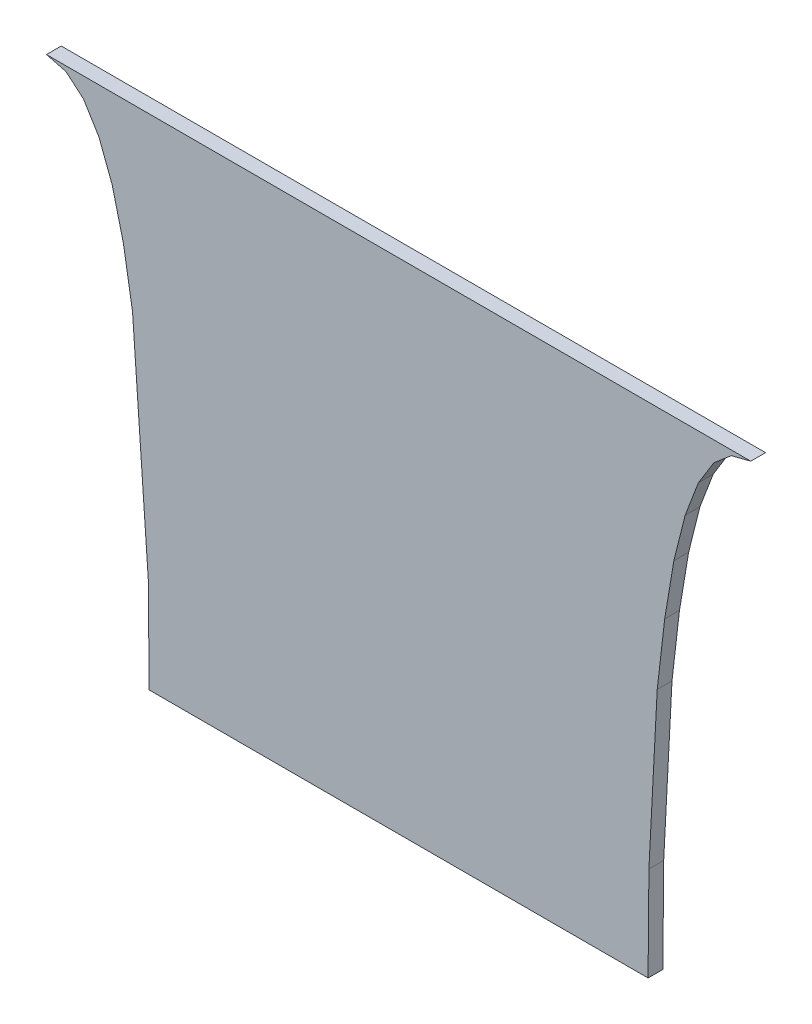
ISO-10303-21;
HEADER;
FILE_DESCRIPTION(('STEP AP214'),'2;1');
FILE_NAME('part.step','',(''),(''),'','','');
FILE_SCHEMA(('AUTOMOTIVE_DESIGN { 1 0 10303 214 1 1 1 1 }'));
ENDSEC;
DATA;
#1=APPLICATION_CONTEXT('core data for automotive mechanical design processes');
#2=APPLICATION_PROTOCOL_DEFINITION('international standard','automotive_design',2000,#1);
#3=PRODUCT_CONTEXT('',#1,'mechanical');
#4=PRODUCT('Part','Part','',(#3));
#5=PRODUCT_RELATED_PRODUCT_CATEGORY('part','',(#4));
#6=PRODUCT_DEFINITION_FORMATION('','',#4);
#7=PRODUCT_DEFINITION_CONTEXT('part definition',#1,'design');
#8=PRODUCT_DEFINITION('design','',#6,#7);
#9=PRODUCT_DEFINITION_SHAPE('','',#8);
#10=(LENGTH_UNIT() NAMED_UNIT(*) SI_UNIT(.MILLI.,.METRE.));
#11=(NAMED_UNIT(*) PLANE_ANGLE_UNIT() SI_UNIT($,.RADIAN.));
#12=(NAMED_UNIT(*) SI_UNIT($,.STERADIAN.) SOLID_ANGLE_UNIT());
#13=UNCERTAINTY_MEASURE_WITH_UNIT(LENGTH_MEASURE(1.E-05),#10,'distance_accuracy_value','');
#14=(GEOMETRIC_REPRESENTATION_CONTEXT(3) GLOBAL_UNCERTAINTY_ASSIGNED_CONTEXT((#13)) GLOBAL_UNIT_ASSIGNED_CONTEXT((#10,
#11,#12)) REPRESENTATION_CONTEXT('',''));
#15=CARTESIAN_POINT('',(0.,0.,0.));
#16=DIRECTION('',(0.,0.,1.));
#17=DIRECTION('',(1.,0.,0.));
#18=AXIS2_PLACEMENT_3D('',#15,#16,#17);
#19=CARTESIAN_POINT('',(55.4799995422363,60.5530014038086,0.));
#20=DIRECTION('',(-0.999961570025521,0.00876689637754941,0.));
#21=DIRECTION('',(0.00876689637754941,0.999961570025521,0.));
#22=AXIS2_PLACEMENT_3D('',#19,#20,#21);
#23=PLANE('',#22);
#24=DIRECTION('',(0.00876689637754941,0.999961570025521,0.));
#25=VECTOR('',#24,1.);
#26=CARTESIAN_POINT('',(55.4799995422363,60.5530014038086,0.03556));
#27=LINE('',#26,#25);
#28=CARTESIAN_POINT('',(55.4799995422363,60.5530014038086,0.03556));
#29=VERTEX_POINT('',#28);
#30=CARTESIAN_POINT('',(55.4819984436035,60.7809982299805,0.03556));
#31=VERTEX_POINT('',#30);
#32=EDGE_CURVE('E11',#29,#31,#27,.T.);
#33=ORIENTED_EDGE('',*,*,#32,.F.);
#34=DIRECTION('',(0.,0.,1.));
#35=VECTOR('',#34,1.);
#36=CARTESIAN_POINT('',(55.4799995422363,60.5530014038086,0.));
#37=LINE('',#36,#35);
#38=CARTESIAN_POINT('',(55.4799995422363,60.5530014038086,0.));
#39=VERTEX_POINT('',#38);
#40=EDGE_CURVE('E24',#39,#29,#37,.T.);
#41=ORIENTED_EDGE('',*,*,#40,.F.);
#42=DIRECTION('',(0.00876689637754941,0.999961570025521,0.));
#43=VECTOR('',#42,1.);
#44=CARTESIAN_POINT('',(55.4799995422363,60.5530014038086,0.));
#45=LINE('',#44,#43);
#46=CARTESIAN_POINT('',(55.4819984436035,60.7809982299805,0.));
#47=VERTEX_POINT('',#46);
#48=EDGE_CURVE('E166',#39,#47,#45,.T.);
#49=ORIENTED_EDGE('',*,*,#48,.T.);
#50=DIRECTION('',(0.,0.,1.));
#51=VECTOR('',#50,1.);
#52=CARTESIAN_POINT('',(55.4819984436035,60.7809982299805,0.));
#53=LINE('',#52,#51);
#54=EDGE_CURVE('E37',#47,#31,#53,.T.);
#55=ORIENTED_EDGE('',*,*,#54,.T.);
#56=EDGE_LOOP('',(#33,#41,#49,#55));
#57=FACE_BOUND('',#56,.T.);
#58=ADVANCED_FACE('F17',(#57),#23,.F.);
#59=CARTESIAN_POINT('',(55.4819984436035,60.7809982299805,0.));
#60=DIRECTION('',(-0.998646373503575,0.0520136586692287,0.));
#61=DIRECTION('',(0.0520136586692287,0.998646373503575,0.));
#62=AXIS2_PLACEMENT_3D('',#59,#60,#61);
#63=PLANE('',#62);
#64=DIRECTION('',(0.0520136586692287,0.998646373503575,0.));
#65=VECTOR('',#64,1.);
#66=CARTESIAN_POINT('',(55.4819984436035,60.7809982299805,0.03556));
#67=LINE('',#66,#65);
#68=CARTESIAN_POINT('',(55.5019989013672,61.1650009155274,0.03556));
#69=VERTEX_POINT('',#68);
#70=EDGE_CURVE('E294',#31,#69,#67,.T.);
#71=ORIENTED_EDGE('',*,*,#70,.F.);
#72=ORIENTED_EDGE('',*,*,#54,.F.);
#73=DIRECTION('',(0.0520136586692287,0.998646373503575,0.));
#74=VECTOR('',#73,1.);
#75=CARTESIAN_POINT('',(55.4819984436035,60.7809982299805,0.));
#76=LINE('',#75,#74);
#77=CARTESIAN_POINT('',(55.5019989013672,61.1650009155274,0.));
#78=VERTEX_POINT('',#77);
#79=EDGE_CURVE('E291',#47,#78,#76,.T.);
#80=ORIENTED_EDGE('',*,*,#79,.T.);
#81=DIRECTION('',(0.,0.,1.));
#82=VECTOR('',#81,1.);
#83=CARTESIAN_POINT('',(55.5019989013672,61.1650009155274,0.));
#84=LINE('',#83,#82);
#85=EDGE_CURVE('E289',#78,#69,#84,.T.);
#86=ORIENTED_EDGE('',*,*,#85,.T.);
#87=EDGE_LOOP('',(#71,#72,#80,#86));
#88=FACE_BOUND('',#87,.T.);
#89=ADVANCED_FACE('F302',(#88),#63,.F.);
#90=CARTESIAN_POINT('',(55.5019989013672,61.1650009155274,0.));
#91=DIRECTION('',(-0.993407659136023,0.114635172481608,0.));
#92=DIRECTION('',(0.114635172481608,0.993407659136023,0.));
#93=AXIS2_PLACEMENT_3D('',#90,#91,#92);
#94=PLANE('',#93);
#95=DIRECTION('',(0.114635172481608,0.993407659136023,0.));
#96=VECTOR('',#95,1.);
#97=CARTESIAN_POINT('',(55.5019989013672,61.1650009155274,0.03556));
#98=LINE('',#97,#96);
#99=CARTESIAN_POINT('',(55.5200004577637,61.3209991455078,0.03556));
#100=VERTEX_POINT('',#99);
#101=EDGE_CURVE('E286',#69,#100,#98,.T.);
#102=ORIENTED_EDGE('',*,*,#101,.F.);
#103=ORIENTED_EDGE('',*,*,#85,.F.);
#104=DIRECTION('',(0.114635172481608,0.993407659136023,0.));
#105=VECTOR('',#104,1.);
#106=CARTESIAN_POINT('',(55.5019989013672,61.1650009155274,0.));
#107=LINE('',#106,#105);
#108=CARTESIAN_POINT('',(55.5200004577637,61.3209991455078,0.));
#109=VERTEX_POINT('',#108);
#110=EDGE_CURVE('E283',#78,#109,#107,.T.);
#111=ORIENTED_EDGE('',*,*,#110,.T.);
#112=DIRECTION('',(0.,0.,1.));
#113=VECTOR('',#112,1.);
#114=CARTESIAN_POINT('',(55.5200004577637,61.3209991455078,0.));
#115=LINE('',#114,#113);
#116=EDGE_CURVE('E281',#109,#100,#115,.T.);
#117=ORIENTED_EDGE('',*,*,#116,.T.);
#118=EDGE_LOOP('',(#102,#103,#111,#117));
#119=FACE_BOUND('',#118,.T.);
#120=ADVANCED_FACE('F308',(#119),#94,.F.);
#121=CARTESIAN_POINT('',(55.5200004577637,61.3209991455078,0.));
#122=DIRECTION('',(-0.986394694254976,0.16439436470157,0.));
#123=DIRECTION('',(0.16439436470157,0.986394694254976,0.));
#124=AXIS2_PLACEMENT_3D('',#121,#122,#123);
#125=PLANE('',#124);
#126=DIRECTION('',(0.16439436470157,0.986394694254976,0.));
#127=VECTOR('',#126,1.);
#128=CARTESIAN_POINT('',(55.5200004577637,61.3209991455078,0.03556));
#129=LINE('',#128,#127);
#130=CARTESIAN_POINT('',(55.5419998168945,61.4529991149902,0.03556));
#131=VERTEX_POINT('',#130);
#132=EDGE_CURVE('E278',#100,#131,#129,.T.);
#133=ORIENTED_EDGE('',*,*,#132,.F.);
#134=ORIENTED_EDGE('',*,*,#116,.F.);
#135=DIRECTION('',(0.16439436470157,0.986394694254976,0.));
#136=VECTOR('',#135,1.);
#137=CARTESIAN_POINT('',(55.5200004577637,61.3209991455078,0.));
#138=LINE('',#137,#136);
#139=CARTESIAN_POINT('',(55.5419998168945,61.4529991149902,0.));
#140=VERTEX_POINT('',#139);
#141=EDGE_CURVE('E275',#109,#140,#138,.T.);
#142=ORIENTED_EDGE('',*,*,#141,.T.);
#143=DIRECTION('',(0.,0.,1.));
#144=VECTOR('',#143,1.);
#145=CARTESIAN_POINT('',(55.5419998168945,61.4529991149902,0.));
#146=LINE('',#145,#144);
#147=EDGE_CURVE('E273',#140,#131,#146,.T.);
#148=ORIENTED_EDGE('',*,*,#147,.T.);
#149=EDGE_LOOP('',(#133,#134,#142,#148));
#150=FACE_BOUND('',#149,.T.);
#151=ADVANCED_FACE('F310',(#150),#125,.F.);
#152=CARTESIAN_POINT('',(55.5419998168945,61.4529991149902,0.));
#153=DIRECTION('',(-0.970142500145332,0.242535625036333,0.));
#154=DIRECTION('',(0.242535625036333,0.970142500145332,0.));
#155=AXIS2_PLACEMENT_3D('',#152,#153,#154);
#156=PLANE('',#155);
#157=DIRECTION('',(0.242535625036333,0.970142500145332,0.));
#158=VECTOR('',#157,1.);
#159=CARTESIAN_POINT('',(55.5419998168945,61.4529991149902,0.03556));
#160=LINE('',#159,#158);
#161=CARTESIAN_POINT('',(55.5690002441406,61.5610008239746,0.03556));
#162=VERTEX_POINT('',#161);
#163=EDGE_CURVE('E270',#131,#162,#160,.T.);
#164=ORIENTED_EDGE('',*,*,#163,.F.);
#165=ORIENTED_EDGE('',*,*,#147,.F.);
#166=DIRECTION('',(0.242535625036333,0.970142500145332,0.));
#167=VECTOR('',#166,1.);
#168=CARTESIAN_POINT('',(55.5419998168945,61.4529991149902,0.));
#169=LINE('',#168,#167);
#170=CARTESIAN_POINT('',(55.5690002441406,61.5610008239746,0.));
#171=VERTEX_POINT('',#170);
#172=EDGE_CURVE('E267',#140,#171,#169,.T.);
#173=ORIENTED_EDGE('',*,*,#172,.T.);
#174=DIRECTION('',(0.,0.,1.));
#175=VECTOR('',#174,1.);
#176=CARTESIAN_POINT('',(55.5690002441406,61.5610008239746,0.));
#177=LINE('',#176,#175);
#178=EDGE_CURVE('E265',#171,#162,#177,.T.);
#179=ORIENTED_EDGE('',*,*,#178,.T.);
#180=EDGE_LOOP('',(#164,#165,#173,#179));
#181=FACE_BOUND('',#180,.T.);
#182=ADVANCED_FACE('F315',(#181),#156,.F.);
#183=CARTESIAN_POINT('',(55.5690002441406,61.5610008239746,0.));
#184=DIRECTION('',(-0.934481684247574,0.356011210224927,0.));
#185=DIRECTION('',(0.356011210224927,0.934481684247574,0.));
#186=AXIS2_PLACEMENT_3D('',#183,#184,#185);
#187=PLANE('',#186);
#188=DIRECTION('',(0.356011210224927,0.934481684247574,0.));
#189=VECTOR('',#188,1.);
#190=CARTESIAN_POINT('',(55.5690002441406,61.5610008239746,0.03556));
#191=LINE('',#190,#189);
#192=CARTESIAN_POINT('',(55.601001739502,61.6450004577637,0.03556));
#193=VERTEX_POINT('',#192);
#194=EDGE_CURVE('E262',#162,#193,#191,.T.);
#195=ORIENTED_EDGE('',*,*,#194,.F.);
#196=ORIENTED_EDGE('',*,*,#178,.F.);
#197=DIRECTION('',(0.356011210224927,0.934481684247574,0.));
#198=VECTOR('',#197,1.);
#199=CARTESIAN_POINT('',(55.5690002441406,61.5610008239746,0.));
#200=LINE('',#199,#198);
#201=CARTESIAN_POINT('',(55.601001739502,61.6450004577637,0.));
#202=VERTEX_POINT('',#201);
#203=EDGE_CURVE('E259',#171,#202,#200,.T.);
#204=ORIENTED_EDGE('',*,*,#203,.T.);
#205=DIRECTION('',(0.,0.,1.));
#206=VECTOR('',#205,1.);
#207=CARTESIAN_POINT('',(55.601001739502,61.6450004577637,0.));
#208=LINE('',#207,#206);
#209=EDGE_CURVE('E257',#202,#193,#208,.T.);
#210=ORIENTED_EDGE('',*,*,#209,.T.);
#211=EDGE_LOOP('',(#195,#196,#204,#210));
#212=FACE_BOUND('',#211,.T.);
#213=ADVANCED_FACE('F318',(#212),#187,.F.);
#214=CARTESIAN_POINT('',(55.601001739502,61.6450004577637,0.));
#215=DIRECTION('',(-0.851184166923057,0.524867139359573,0.));
#216=DIRECTION('',(0.524867139359573,0.851184166923057,0.));
#217=AXIS2_PLACEMENT_3D('',#214,#215,#216);
#218=PLANE('',#217);
#219=DIRECTION('',(0.524867139359573,0.851184166923057,0.));
#220=VECTOR('',#219,1.);
#221=CARTESIAN_POINT('',(55.601001739502,61.6450004577637,0.03556));
#222=LINE('',#221,#220);
#223=CARTESIAN_POINT('',(55.6380004882812,61.7050018310547,0.03556));
#224=VERTEX_POINT('',#223);
#225=EDGE_CURVE('E254',#193,#224,#222,.T.);
#226=ORIENTED_EDGE('',*,*,#225,.F.);
#227=ORIENTED_EDGE('',*,*,#209,.F.);
#228=DIRECTION('',(0.524867139359573,0.851184166923057,0.));
#229=VECTOR('',#228,1.);
#230=CARTESIAN_POINT('',(55.601001739502,61.6450004577637,0.));
#231=LINE('',#230,#229);
#232=CARTESIAN_POINT('',(55.6380004882812,61.7050018310547,0.));
#233=VERTEX_POINT('',#232);
#234=EDGE_CURVE('E251',#202,#233,#231,.T.);
#235=ORIENTED_EDGE('',*,*,#234,.T.);
#236=DIRECTION('',(0.,0.,1.));
#237=VECTOR('',#236,1.);
#238=CARTESIAN_POINT('',(55.6380004882812,61.7050018310547,0.));
#239=LINE('',#238,#237);
#240=EDGE_CURVE('E249',#233,#224,#239,.T.);
#241=ORIENTED_EDGE('',*,*,#240,.T.);
#242=EDGE_LOOP('',(#226,#227,#235,#241));
#243=FACE_BOUND('',#242,.T.);
#244=ADVANCED_FACE('F323',(#243),#218,.F.);
#245=CARTESIAN_POINT('',(55.6380004882812,61.7050018310547,0.));
#246=DIRECTION('',(-0.650785694290153,0.759261470184866,0.));
#247=DIRECTION('',(0.759261470184866,0.650785694290153,0.));
#248=AXIS2_PLACEMENT_3D('',#245,#246,#247);
#249=PLANE('',#248);
#250=DIRECTION('',(0.759261470184866,0.650785694290152,0.));
#251=VECTOR('',#250,1.);
#252=CARTESIAN_POINT('',(55.6380004882812,61.7050018310547,0.03556));
#253=LINE('',#252,#251);
#254=CARTESIAN_POINT('',(55.6800003051758,61.7410011291504,0.03556));
#255=VERTEX_POINT('',#254);
#256=EDGE_CURVE('E246',#224,#255,#253,.T.);
#257=ORIENTED_EDGE('',*,*,#256,.F.);
#258=ORIENTED_EDGE('',*,*,#240,.F.);
#259=DIRECTION('',(0.759261470184866,0.650785694290152,0.));
#260=VECTOR('',#259,1.);
#261=CARTESIAN_POINT('',(55.6380004882812,61.7050018310547,0.));
#262=LINE('',#261,#260);
#263=CARTESIAN_POINT('',(55.6800003051758,61.7410011291504,0.));
#264=VERTEX_POINT('',#263);
#265=EDGE_CURVE('E243',#233,#264,#262,.T.);
#266=ORIENTED_EDGE('',*,*,#265,.T.);
#267=DIRECTION('',(0.,0.,1.));
#268=VECTOR('',#267,1.);
#269=CARTESIAN_POINT('',(55.6800003051758,61.7410011291504,0.));
#270=LINE('',#269,#268);
#271=EDGE_CURVE('E241',#264,#255,#270,.T.);
#272=ORIENTED_EDGE('',*,*,#271,.T.);
#273=EDGE_LOOP('',(#257,#258,#266,#272));
#274=FACE_BOUND('',#273,.T.);
#275=ADVANCED_FACE('F326',(#274),#249,.F.);
#276=CARTESIAN_POINT('',(55.6800003051758,61.7410011291504,0.));
#277=DIRECTION('',(-0.247325124869417,0.968932548017832,0.));
#278=DIRECTION('',(0.968932548017832,0.247325124869417,0.));
#279=AXIS2_PLACEMENT_3D('',#276,#277,#278);
#280=PLANE('',#279);
#281=DIRECTION('',(0.968932548017832,0.247325124869417,0.));
#282=VECTOR('',#281,1.);
#283=CARTESIAN_POINT('',(55.6800003051758,61.7410011291504,0.03556));
#284=LINE('',#283,#282);
#285=CARTESIAN_POINT('',(55.7270011901855,61.7529983520508,0.03556));
#286=VERTEX_POINT('',#285);
#287=EDGE_CURVE('E238',#255,#286,#284,.T.);
#288=ORIENTED_EDGE('',*,*,#287,.F.);
#289=ORIENTED_EDGE('',*,*,#271,.F.);
#290=DIRECTION('',(0.968932548017832,0.247325124869417,0.));
#291=VECTOR('',#290,1.);
#292=CARTESIAN_POINT('',(55.6800003051758,61.7410011291504,0.));
#293=LINE('',#292,#291);
#294=CARTESIAN_POINT('',(55.7270011901855,61.7529983520508,0.));
#295=VERTEX_POINT('',#294);
#296=EDGE_CURVE('E235',#264,#295,#293,.T.);
#297=ORIENTED_EDGE('',*,*,#296,.T.);
#298=DIRECTION('',(0.,0.,1.));
#299=VECTOR('',#298,1.);
#300=CARTESIAN_POINT('',(55.7270011901855,61.7529983520508,0.));
#301=LINE('',#300,#299);
#302=EDGE_CURVE('E233',#295,#286,#301,.T.);
#303=ORIENTED_EDGE('',*,*,#302,.T.);
#304=EDGE_LOOP('',(#288,#289,#297,#303));
#305=FACE_BOUND('',#304,.T.);
#306=ADVANCED_FACE('F331',(#305),#280,.F.);
#307=CARTESIAN_POINT('',(55.7270011901855,61.7529983520508,0.));
#308=DIRECTION('',(0.,-1.,0.));
#309=DIRECTION('',(-1.,0.,0.));
#310=AXIS2_PLACEMENT_3D('',#307,#308,#309);
#311=PLANE('',#310);
#312=DIRECTION('',(-1.,0.,0.));
#313=VECTOR('',#312,1.);
#314=CARTESIAN_POINT('',(55.7270011901855,61.7529983520508,0.03556));
#315=LINE('',#314,#313);
#316=CARTESIAN_POINT('',(54.0330009460449,61.7529983520508,0.03556));
#317=VERTEX_POINT('',#316);
#318=EDGE_CURVE('E230',#286,#317,#315,.T.);
#319=ORIENTED_EDGE('',*,*,#318,.F.);
#320=ORIENTED_EDGE('',*,*,#302,.F.);
#321=DIRECTION('',(-1.,0.,0.));
#322=VECTOR('',#321,1.);
#323=CARTESIAN_POINT('',(55.7270011901855,61.7529983520508,0.));
#324=LINE('',#323,#322);
#325=CARTESIAN_POINT('',(54.0330009460449,61.7529983520508,0.));
#326=VERTEX_POINT('',#325);
#327=EDGE_CURVE('E227',#295,#326,#324,.T.);
#328=ORIENTED_EDGE('',*,*,#327,.T.);
#329=DIRECTION('',(0.,0.,1.));
#330=VECTOR('',#329,1.);
#331=CARTESIAN_POINT('',(54.0330009460449,61.7529983520508,0.));
#332=LINE('',#331,#330);
#333=EDGE_CURVE('E225',#326,#317,#332,.T.);
#334=ORIENTED_EDGE('',*,*,#333,.T.);
#335=EDGE_LOOP('',(#319,#320,#328,#334));
#336=FACE_BOUND('',#335,.T.);
#337=ADVANCED_FACE('F334',(#336),#311,.F.);
#338=CARTESIAN_POINT('',(54.0330009460449,61.7529983520508,0.));
#339=DIRECTION('',(0.247325124869417,0.968932548017832,0.));
#340=DIRECTION('',(0.968932548017832,-0.247325124869417,0.));
#341=AXIS2_PLACEMENT_3D('',#338,#339,#340);
#342=PLANE('',#341);
#343=DIRECTION('',(0.968932548017832,-0.247325124869417,0.));
#344=VECTOR('',#343,1.);
#345=CARTESIAN_POINT('',(54.0330009460449,61.7529983520508,0.03556));
#346=LINE('',#345,#344);
#347=CARTESIAN_POINT('',(54.0800018310547,61.7410011291504,0.03556));
#348=VERTEX_POINT('',#347);
#349=EDGE_CURVE('E222',#317,#348,#346,.T.);
#350=ORIENTED_EDGE('',*,*,#349,.F.);
#351=ORIENTED_EDGE('',*,*,#333,.F.);
#352=DIRECTION('',(0.968932548017832,-0.247325124869417,0.));
#353=VECTOR('',#352,1.);
#354=CARTESIAN_POINT('',(54.0330009460449,61.7529983520508,0.));
#355=LINE('',#354,#353);
#356=CARTESIAN_POINT('',(54.0800018310547,61.7410011291504,0.));
#357=VERTEX_POINT('',#356);
#358=EDGE_CURVE('E219',#326,#357,#355,.T.);
#359=ORIENTED_EDGE('',*,*,#358,.T.);
#360=DIRECTION('',(0.,0.,1.));
#361=VECTOR('',#360,1.);
#362=CARTESIAN_POINT('',(54.0800018310547,61.7410011291504,0.));
#363=LINE('',#362,#361);
#364=EDGE_CURVE('E217',#357,#348,#363,.T.);
#365=ORIENTED_EDGE('',*,*,#364,.T.);
#366=EDGE_LOOP('',(#350,#351,#359,#365));
#367=FACE_BOUND('',#366,.T.);
#368=ADVANCED_FACE('F339',(#367),#342,.F.);
#369=CARTESIAN_POINT('',(54.0800018310547,61.7410011291504,0.));
#370=DIRECTION('',(0.650785694290153,0.759261470184866,0.));
#371=DIRECTION('',(0.759261470184866,-0.650785694290153,0.));
#372=AXIS2_PLACEMENT_3D('',#369,#370,#371);
#373=PLANE('',#372);
#374=DIRECTION('',(0.759261470184866,-0.650785694290152,0.));
#375=VECTOR('',#374,1.);
#376=CARTESIAN_POINT('',(54.0800018310547,61.7410011291504,0.03556));
#377=LINE('',#376,#375);
#378=CARTESIAN_POINT('',(54.1220016479492,61.7050018310547,0.03556));
#379=VERTEX_POINT('',#378);
#380=EDGE_CURVE('E214',#348,#379,#377,.T.);
#381=ORIENTED_EDGE('',*,*,#380,.F.);
#382=ORIENTED_EDGE('',*,*,#364,.F.);
#383=DIRECTION('',(0.759261470184866,-0.650785694290152,0.));
#384=VECTOR('',#383,1.);
#385=CARTESIAN_POINT('',(54.0800018310547,61.7410011291504,0.));
#386=LINE('',#385,#384);
#387=CARTESIAN_POINT('',(54.1220016479492,61.7050018310547,0.));
#388=VERTEX_POINT('',#387);
#389=EDGE_CURVE('E211',#357,#388,#386,.T.);
#390=ORIENTED_EDGE('',*,*,#389,.T.);
#391=DIRECTION('',(0.,0.,1.));
#392=VECTOR('',#391,1.);
#393=CARTESIAN_POINT('',(54.1220016479492,61.7050018310547,0.));
#394=LINE('',#393,#392);
#395=EDGE_CURVE('E209',#388,#379,#394,.T.);
#396=ORIENTED_EDGE('',*,*,#395,.T.);
#397=EDGE_LOOP('',(#381,#382,#390,#396));
#398=FACE_BOUND('',#397,.T.);
#399=ADVANCED_FACE('F342',(#398),#373,.F.);
#400=CARTESIAN_POINT('',(54.1220016479492,61.7050018310547,0.));
#401=DIRECTION('',(0.851184166923057,0.524867139359573,0.));
#402=DIRECTION('',(0.524867139359573,-0.851184166923057,0.));
#403=AXIS2_PLACEMENT_3D('',#400,#401,#402);
#404=PLANE('',#403);
#405=DIRECTION('',(0.524867139359573,-0.851184166923057,0.));
#406=VECTOR('',#405,1.);
#407=CARTESIAN_POINT('',(54.1220016479492,61.7050018310547,0.03556));
#408=LINE('',#407,#406);
#409=CARTESIAN_POINT('',(54.1590003967285,61.6450004577637,0.03556));
#410=VERTEX_POINT('',#409);
#411=EDGE_CURVE('E206',#379,#410,#408,.T.);
#412=ORIENTED_EDGE('',*,*,#411,.F.);
#413=ORIENTED_EDGE('',*,*,#395,.F.);
#414=DIRECTION('',(0.524867139359573,-0.851184166923057,0.));
#415=VECTOR('',#414,1.);
#416=CARTESIAN_POINT('',(54.1220016479492,61.7050018310547,0.));
#417=LINE('',#416,#415);
#418=CARTESIAN_POINT('',(54.1590003967285,61.6450004577637,0.));
#419=VERTEX_POINT('',#418);
#420=EDGE_CURVE('E203',#388,#419,#417,.T.);
#421=ORIENTED_EDGE('',*,*,#420,.T.);
#422=DIRECTION('',(0.,0.,1.));
#423=VECTOR('',#422,1.);
#424=CARTESIAN_POINT('',(54.1590003967285,61.6450004577637,0.));
#425=LINE('',#424,#423);
#426=EDGE_CURVE('E201',#419,#410,#425,.T.);
#427=ORIENTED_EDGE('',*,*,#426,.T.);
#428=EDGE_LOOP('',(#412,#413,#421,#427));
#429=FACE_BOUND('',#428,.T.);
#430=ADVANCED_FACE('F347',(#429),#404,.F.);
#431=CARTESIAN_POINT('',(54.1590003967285,61.6450004577637,0.));
#432=DIRECTION('',(0.934481684247574,0.356011210224927,0.));
#433=DIRECTION('',(0.356011210224927,-0.934481684247574,0.));
#434=AXIS2_PLACEMENT_3D('',#431,#432,#433);
#435=PLANE('',#434);
#436=DIRECTION('',(0.356011210224927,-0.934481684247574,0.));
#437=VECTOR('',#436,1.);
#438=CARTESIAN_POINT('',(54.1590003967285,61.6450004577637,0.03556));
#439=LINE('',#438,#437);
#440=CARTESIAN_POINT('',(54.1910018920898,61.5610008239746,0.03556));
#441=VERTEX_POINT('',#440);
#442=EDGE_CURVE('E198',#410,#441,#439,.T.);
#443=ORIENTED_EDGE('',*,*,#442,.F.);
#444=ORIENTED_EDGE('',*,*,#426,.F.);
#445=DIRECTION('',(0.356011210224927,-0.934481684247574,0.));
#446=VECTOR('',#445,1.);
#447=CARTESIAN_POINT('',(54.1590003967285,61.6450004577637,0.));
#448=LINE('',#447,#446);
#449=CARTESIAN_POINT('',(54.1910018920898,61.5610008239746,0.));
#450=VERTEX_POINT('',#449);
#451=EDGE_CURVE('E195',#419,#450,#448,.T.);
#452=ORIENTED_EDGE('',*,*,#451,.T.);
#453=DIRECTION('',(0.,0.,1.));
#454=VECTOR('',#453,1.);
#455=CARTESIAN_POINT('',(54.1910018920898,61.5610008239746,0.));
#456=LINE('',#455,#454);
#457=EDGE_CURVE('E193',#450,#441,#456,.T.);
#458=ORIENTED_EDGE('',*,*,#457,.T.);
#459=EDGE_LOOP('',(#443,#444,#452,#458));
#460=FACE_BOUND('',#459,.T.);
#461=ADVANCED_FACE('F350',(#460),#435,.F.);
#462=CARTESIAN_POINT('',(54.1910018920898,61.5610008239746,0.));
#463=DIRECTION('',(0.970150562293665,0.242503374164745,0.));
#464=DIRECTION('',(0.242503374164745,-0.970150562293665,0.));
#465=AXIS2_PLACEMENT_3D('',#462,#463,#464);
#466=PLANE('',#465);
#467=DIRECTION('',(0.242503374164745,-0.970150562293665,0.));
#468=VECTOR('',#467,1.);
#469=CARTESIAN_POINT('',(54.1910018920898,61.5610008239746,0.03556));
#470=LINE('',#469,#468);
#471=CARTESIAN_POINT('',(54.2179985046387,61.4529991149902,0.03556));
#472=VERTEX_POINT('',#471);
#473=EDGE_CURVE('E190',#441,#472,#470,.T.);
#474=ORIENTED_EDGE('',*,*,#473,.F.);
#475=ORIENTED_EDGE('',*,*,#457,.F.);
#476=DIRECTION('',(0.242503374164745,-0.970150562293665,0.));
#477=VECTOR('',#476,1.);
#478=CARTESIAN_POINT('',(54.1910018920898,61.5610008239746,0.));
#479=LINE('',#478,#477);
#480=CARTESIAN_POINT('',(54.2179985046387,61.4529991149902,0.));
#481=VERTEX_POINT('',#480);
#482=EDGE_CURVE('E187',#450,#481,#479,.T.);
#483=ORIENTED_EDGE('',*,*,#482,.T.);
#484=DIRECTION('',(0.,0.,1.));
#485=VECTOR('',#484,1.);
#486=CARTESIAN_POINT('',(54.2179985046387,61.4529991149902,0.));
#487=LINE('',#486,#485);
#488=EDGE_CURVE('E185',#481,#472,#487,.T.);
#489=ORIENTED_EDGE('',*,*,#488,.T.);
#490=EDGE_LOOP('',(#474,#475,#483,#489));
#491=FACE_BOUND('',#490,.T.);
#492=ADVANCED_FACE('F355',(#491),#466,.F.);
#493=CARTESIAN_POINT('',(54.2179985046387,61.4529991149902,0.));
#494=DIRECTION('',(0.986390071411092,0.164422100161812,0.));
#495=DIRECTION('',(0.164422100161812,-0.986390071411092,0.));
#496=AXIS2_PLACEMENT_3D('',#493,#494,#495);
#497=PLANE('',#496);
#498=DIRECTION('',(0.164422100161812,-0.986390071411092,0.));
#499=VECTOR('',#498,1.);
#500=CARTESIAN_POINT('',(54.2179985046387,61.4529991149902,0.03556));
#501=LINE('',#500,#499);
#502=CARTESIAN_POINT('',(54.2400016784668,61.3209991455078,0.03556));
#503=VERTEX_POINT('',#502);
#504=EDGE_CURVE('E182',#472,#503,#501,.T.);
#505=ORIENTED_EDGE('',*,*,#504,.F.);
#506=ORIENTED_EDGE('',*,*,#488,.F.);
#507=DIRECTION('',(0.164422100161812,-0.986390071411092,0.));
#508=VECTOR('',#507,1.);
#509=CARTESIAN_POINT('',(54.2179985046387,61.4529991149902,0.));
#510=LINE('',#509,#508);
#511=CARTESIAN_POINT('',(54.2400016784668,61.3209991455078,0.));
#512=VERTEX_POINT('',#511);
#513=EDGE_CURVE('E179',#481,#512,#510,.T.);
#514=ORIENTED_EDGE('',*,*,#513,.T.);
#515=DIRECTION('',(0.,0.,1.));
#516=VECTOR('',#515,1.);
#517=CARTESIAN_POINT('',(54.2400016784668,61.3209991455078,0.));
#518=LINE('',#517,#516);
#519=EDGE_CURVE('E177',#512,#503,#518,.T.);
#520=ORIENTED_EDGE('',*,*,#519,.T.);
#521=EDGE_LOOP('',(#505,#506,#514,#520));
#522=FACE_BOUND('',#521,.T.);
#523=ADVANCED_FACE('F358',(#522),#497,.F.);
#524=CARTESIAN_POINT('',(54.2400016784668,61.3209991455078,0.));
#525=DIRECTION('',(0.997533404759118,0.0701933500388927,0.));
#526=DIRECTION('',(0.0701933500388927,-0.997533404759118,0.));
#527=AXIS2_PLACEMENT_3D('',#524,#525,#526);
#528=PLANE('',#527);
#529=DIRECTION('',(0.0701933500388927,-0.997533404759118,0.));
#530=VECTOR('',#529,1.);
#531=CARTESIAN_POINT('',(54.2400016784668,61.3209991455078,0.03556));
#532=LINE('',#531,#530);
#533=CARTESIAN_POINT('',(54.2779998779297,60.7809982299805,0.03556));
#534=VERTEX_POINT('',#533);
#535=EDGE_CURVE('E174',#503,#534,#532,.T.);
#536=ORIENTED_EDGE('',*,*,#535,.F.);
#537=ORIENTED_EDGE('',*,*,#519,.F.);
#538=DIRECTION('',(0.0701933500388927,-0.997533404759118,0.));
#539=VECTOR('',#538,1.);
#540=CARTESIAN_POINT('',(54.2400016784668,61.3209991455078,0.));
#541=LINE('',#540,#539);
#542=CARTESIAN_POINT('',(54.2779998779297,60.7809982299805,0.));
#543=VERTEX_POINT('',#542);
#544=EDGE_CURVE('E172',#512,#543,#541,.T.);
#545=ORIENTED_EDGE('',*,*,#544,.T.);
#546=DIRECTION('',(0.,0.,1.));
#547=VECTOR('',#546,1.);
#548=CARTESIAN_POINT('',(54.2779998779297,60.7809982299805,0.));
#549=LINE('',#548,#547);
#550=EDGE_CURVE('E157',#543,#534,#549,.T.);
#551=ORIENTED_EDGE('',*,*,#550,.T.);
#552=EDGE_LOOP('',(#536,#537,#545,#551));
#553=FACE_BOUND('',#552,.T.);
#554=ADVANCED_FACE('F361',(#553),#528,.F.);
#555=CARTESIAN_POINT('',(54.2779998779297,60.7809982299805,0.));
#556=DIRECTION('',(0.999961570025521,0.00876689637754941,0.));
#557=DIRECTION('',(0.00876689637754941,-0.999961570025521,0.));
#558=AXIS2_PLACEMENT_3D('',#555,#556,#557);
#559=PLANE('',#558);
#560=DIRECTION('',(0.00876689637754941,-0.999961570025521,0.));
#561=VECTOR('',#560,1.);
#562=CARTESIAN_POINT('',(54.2779998779297,60.7809982299805,0.03556));
#563=LINE('',#562,#561);
#564=CARTESIAN_POINT('',(54.2799987792969,60.5530014038086,0.03556));
#565=VERTEX_POINT('',#564);
#566=EDGE_CURVE('E161',#534,#565,#563,.T.);
#567=ORIENTED_EDGE('',*,*,#566,.F.);
#568=ORIENTED_EDGE('',*,*,#550,.F.);
#569=DIRECTION('',(0.00876689637754941,-0.999961570025521,0.));
#570=VECTOR('',#569,1.);
#571=CARTESIAN_POINT('',(54.2779998779297,60.7809982299805,0.));
#572=LINE('',#571,#570);
#573=CARTESIAN_POINT('',(54.2799987792969,60.5530014038086,0.));
#574=VERTEX_POINT('',#573);
#575=EDGE_CURVE('E153',#543,#574,#572,.T.);
#576=ORIENTED_EDGE('',*,*,#575,.T.);
#577=DIRECTION('',(0.,0.,1.));
#578=VECTOR('',#577,1.);
#579=CARTESIAN_POINT('',(54.2799987792969,60.5530014038086,0.));
#580=LINE('',#579,#578);
#581=EDGE_CURVE('E143',#574,#565,#580,.T.);
#582=ORIENTED_EDGE('',*,*,#581,.T.);
#583=EDGE_LOOP('',(#567,#568,#576,#582));
#584=FACE_BOUND('',#583,.T.);
#585=ADVANCED_FACE('F156',(#584),#559,.F.);
#586=CARTESIAN_POINT('',(54.2799987792969,60.5530014038086,0.));
#587=DIRECTION('',(0.,1.,0.));
#588=DIRECTION('',(1.,0.,0.));
#589=AXIS2_PLACEMENT_3D('',#586,#587,#588);
#590=PLANE('',#589);
#591=DIRECTION('',(1.,0.,0.));
#592=VECTOR('',#591,1.);
#593=CARTESIAN_POINT('',(54.2799987792969,60.5530014038086,0.03556));
#594=LINE('',#593,#592);
#595=EDGE_CURVE('E149',#565,#29,#594,.T.);
#596=ORIENTED_EDGE('',*,*,#595,.F.);
#597=ORIENTED_EDGE('',*,*,#581,.F.);
#598=DIRECTION('',(1.,0.,0.));
#599=VECTOR('',#598,1.);
#600=CARTESIAN_POINT('',(54.2799987792969,60.5530014038086,0.));
#601=LINE('',#600,#599);
#602=EDGE_CURVE('E147',#574,#39,#601,.T.);
#603=ORIENTED_EDGE('',*,*,#602,.T.);
#604=ORIENTED_EDGE('',*,*,#40,.T.);
#605=EDGE_LOOP('',(#596,#597,#603,#604));
#606=FACE_BOUND('',#605,.T.);
#607=ADVANCED_FACE('F145',(#606),#590,.F.);
#608=CARTESIAN_POINT('',(55.4799995422363,60.5530014038086,0.));
#609=DIRECTION('',(0.,0.,1.));
#610=DIRECTION('',(1.,0.,0.));
#611=AXIS2_PLACEMENT_3D('',#608,#609,#610);
#612=PLANE('',#611);
#613=ORIENTED_EDGE('',*,*,#602,.F.);
#614=ORIENTED_EDGE('',*,*,#575,.F.);
#615=ORIENTED_EDGE('',*,*,#544,.F.);
#616=ORIENTED_EDGE('',*,*,#513,.F.);
#617=ORIENTED_EDGE('',*,*,#482,.F.);
#618=ORIENTED_EDGE('',*,*,#451,.F.);
#619=ORIENTED_EDGE('',*,*,#420,.F.);
#620=ORIENTED_EDGE('',*,*,#389,.F.);
#621=ORIENTED_EDGE('',*,*,#358,.F.);
#622=ORIENTED_EDGE('',*,*,#327,.F.);
#623=ORIENTED_EDGE('',*,*,#296,.F.);
#624=ORIENTED_EDGE('',*,*,#265,.F.);
#625=ORIENTED_EDGE('',*,*,#234,.F.);
#626=ORIENTED_EDGE('',*,*,#203,.F.);
#627=ORIENTED_EDGE('',*,*,#172,.F.);
#628=ORIENTED_EDGE('',*,*,#141,.F.);
#629=ORIENTED_EDGE('',*,*,#110,.F.);
#630=ORIENTED_EDGE('',*,*,#79,.F.);
#631=ORIENTED_EDGE('',*,*,#48,.F.);
#632=EDGE_LOOP('',(#613,#614,#615,#616,#617,#618,#619,#620,#621,#622,#623,#624,#625,#626,#627,
#628,#629,#630,#631));
#633=FACE_BOUND('',#632,.T.);
#634=ADVANCED_FACE('F164',(#633),#612,.F.);
#635=CARTESIAN_POINT('',(55.4799995422363,60.5530014038086,0.03556));
#636=DIRECTION('',(0.,0.,1.));
#637=DIRECTION('',(1.,0.,0.));
#638=AXIS2_PLACEMENT_3D('',#635,#636,#637);
#639=PLANE('',#638);
#640=ORIENTED_EDGE('',*,*,#32,.T.);
#641=ORIENTED_EDGE('',*,*,#70,.T.);
#642=ORIENTED_EDGE('',*,*,#101,.T.);
#643=ORIENTED_EDGE('',*,*,#132,.T.);
#644=ORIENTED_EDGE('',*,*,#163,.T.);
#645=ORIENTED_EDGE('',*,*,#194,.T.);
#646=ORIENTED_EDGE('',*,*,#225,.T.);
#647=ORIENTED_EDGE('',*,*,#256,.T.);
#648=ORIENTED_EDGE('',*,*,#287,.T.);
#649=ORIENTED_EDGE('',*,*,#318,.T.);
#650=ORIENTED_EDGE('',*,*,#349,.T.);
#651=ORIENTED_EDGE('',*,*,#380,.T.);
#652=ORIENTED_EDGE('',*,*,#411,.T.);
#653=ORIENTED_EDGE('',*,*,#442,.T.);
#654=ORIENTED_EDGE('',*,*,#473,.T.);
#655=ORIENTED_EDGE('',*,*,#504,.T.);
#656=ORIENTED_EDGE('',*,*,#535,.T.);
#657=ORIENTED_EDGE('',*,*,#566,.T.);
#658=ORIENTED_EDGE('',*,*,#595,.T.);
#659=EDGE_LOOP('',(#640,#641,#642,#643,#644,#645,#646,#647,#648,#649,#650,#651,#652,#653,#654,
#655,#656,#657,#658));
#660=FACE_BOUND('',#659,.T.);
#661=ADVANCED_FACE('F305',(#660),#639,.T.);
#662=CLOSED_SHELL('',(#58,#89,#120,#151,#182,#213,#244,#275,#306,#337,#368,#399,#430,#461,#492,
#523,#554,#585,#607,#634,#661));
#663=MANIFOLD_SOLID_BREP('B1',#662);
#664=ADVANCED_BREP_SHAPE_REPRESENTATION('',(#18,#663),#14);
#665=SHAPE_DEFINITION_REPRESENTATION(#9,#664);
ENDSEC;
END-ISO-10303-21;
